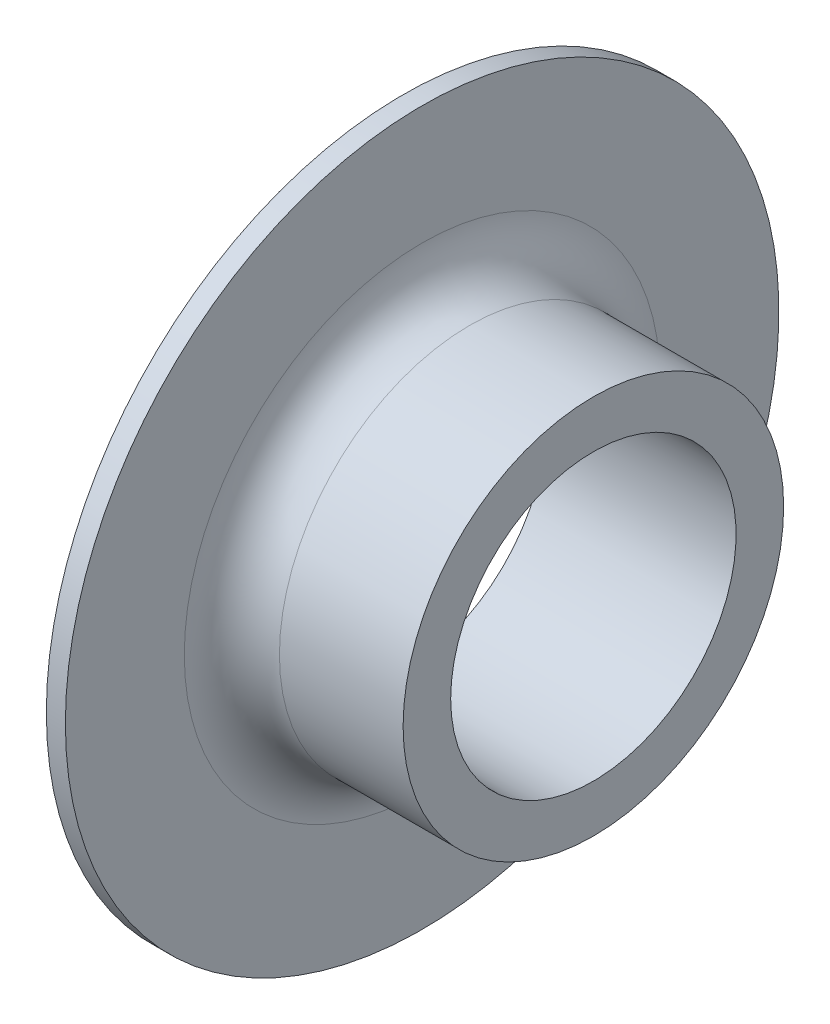
ISO-10303-21;
HEADER;
FILE_DESCRIPTION(('STEP AP214'),'2;1');
FILE_NAME('part.step','',(''),(''),'','','');
FILE_SCHEMA(('AUTOMOTIVE_DESIGN { 1 0 10303 214 1 1 1 1 }'));
ENDSEC;
DATA;
#1=APPLICATION_CONTEXT('core data for automotive mechanical design processes');
#2=APPLICATION_PROTOCOL_DEFINITION('international standard','automotive_design',2000,#1);
#3=PRODUCT_CONTEXT('',#1,'mechanical');
#4=PRODUCT('Part','Part','',(#3));
#5=PRODUCT_RELATED_PRODUCT_CATEGORY('part','',(#4));
#6=PRODUCT_DEFINITION_FORMATION('','',#4);
#7=PRODUCT_DEFINITION_CONTEXT('part definition',#1,'design');
#8=PRODUCT_DEFINITION('design','',#6,#7);
#9=PRODUCT_DEFINITION_SHAPE('','',#8);
#10=(LENGTH_UNIT() NAMED_UNIT(*) SI_UNIT(.MILLI.,.METRE.));
#11=(NAMED_UNIT(*) PLANE_ANGLE_UNIT() SI_UNIT($,.RADIAN.));
#12=(NAMED_UNIT(*) SI_UNIT($,.STERADIAN.) SOLID_ANGLE_UNIT());
#13=UNCERTAINTY_MEASURE_WITH_UNIT(LENGTH_MEASURE(1.E-05),#10,'distance_accuracy_value','');
#14=(GEOMETRIC_REPRESENTATION_CONTEXT(3) GLOBAL_UNCERTAINTY_ASSIGNED_CONTEXT((#13)) GLOBAL_UNIT_ASSIGNED_CONTEXT((#10,
#11,#12)) REPRESENTATION_CONTEXT('',''));
#15=CARTESIAN_POINT('',(0.,0.,0.));
#16=DIRECTION('',(0.,0.,1.));
#17=DIRECTION('',(1.,0.,0.));
#18=AXIS2_PLACEMENT_3D('',#15,#16,#17);
#19=CARTESIAN_POINT('',(0.,0.,0.));
#20=DIRECTION('',(-1.,0.,0.));
#21=DIRECTION('',(0.,0.,1.));
#22=AXIS2_PLACEMENT_3D('',#19,#20,#21);
#23=CYLINDRICAL_SURFACE('',#22,15.);
#24=CARTESIAN_POINT('',(0.,0.,0.));
#25=DIRECTION('',(-1.,0.,0.));
#26=DIRECTION('',(0.,0.,1.));
#27=AXIS2_PLACEMENT_3D('',#24,#25,#26);
#28=CIRCLE('',#27,15.);
#29=CARTESIAN_POINT('',(0.,0.,15.));
#30=VERTEX_POINT('',#29);
#31=EDGE_CURVE('E71',#30,#30,#28,.T.);
#32=ORIENTED_EDGE('',*,*,#31,.T.);
#33=EDGE_LOOP('',(#32));
#34=FACE_BOUND('',#33,.T.);
#35=CARTESIAN_POINT('',(20.,0.,0.));
#36=DIRECTION('',(-1.,0.,0.));
#37=DIRECTION('',(0.,0.,1.));
#38=AXIS2_PLACEMENT_3D('',#35,#36,#37);
#39=CIRCLE('',#38,15.);
#40=CARTESIAN_POINT('',(20.,0.,15.));
#41=VERTEX_POINT('',#40);
#42=EDGE_CURVE('E52',#41,#41,#39,.T.);
#43=ORIENTED_EDGE('',*,*,#42,.F.);
#44=EDGE_LOOP('',(#43));
#45=FACE_BOUND('',#44,.T.);
#46=ADVANCED_FACE('F39',(#34,#45),#23,.F.);
#47=CARTESIAN_POINT('',(20.,0.,0.));
#48=DIRECTION('',(1.,0.,0.));
#49=DIRECTION('',(0.,0.,-1.));
#50=AXIS2_PLACEMENT_3D('',#47,#48,#49);
#51=PLANE('',#50);
#52=ORIENTED_EDGE('',*,*,#42,.T.);
#53=EDGE_LOOP('',(#52));
#54=FACE_BOUND('',#53,.T.);
#55=CARTESIAN_POINT('',(20.,0.,0.));
#56=DIRECTION('',(-1.,0.,0.));
#57=DIRECTION('',(0.,0.,1.));
#58=AXIS2_PLACEMENT_3D('',#55,#56,#57);
#59=CIRCLE('',#58,20.);
#60=CARTESIAN_POINT('',(20.,0.,20.));
#61=VERTEX_POINT('',#60);
#62=EDGE_CURVE('E57',#61,#61,#59,.T.);
#63=ORIENTED_EDGE('',*,*,#62,.F.);
#64=EDGE_LOOP('',(#63));
#65=FACE_BOUND('',#64,.T.);
#66=ADVANCED_FACE('F92',(#54,#65),#51,.T.);
#67=CARTESIAN_POINT('',(0.,0.,0.));
#68=DIRECTION('',(-1.,0.,0.));
#69=DIRECTION('',(0.,0.,1.));
#70=AXIS2_PLACEMENT_3D('',#67,#68,#69);
#71=CYLINDRICAL_SURFACE('',#70,20.);
#72=CARTESIAN_POINT('',(7.,0.,0.));
#73=DIRECTION('',(1.,0.,0.));
#74=DIRECTION('',(0.,0.,-1.));
#75=AXIS2_PLACEMENT_3D('',#72,#73,#74);
#76=CIRCLE('',#75,20.);
#77=CARTESIAN_POINT('',(7.,0.,-20.));
#78=VERTEX_POINT('',#77);
#79=EDGE_CURVE('E10',#78,#78,#76,.T.);
#80=ORIENTED_EDGE('',*,*,#79,.T.);
#81=EDGE_LOOP('',(#80));
#82=FACE_BOUND('',#81,.T.);
#83=ORIENTED_EDGE('',*,*,#62,.T.);
#84=EDGE_LOOP('',(#83));
#85=FACE_BOUND('',#84,.T.);
#86=ADVANCED_FACE('F96',(#82,#85),#71,.T.);
#87=CARTESIAN_POINT('',(2.,0.,0.));
#88=DIRECTION('',(1.,0.,0.));
#89=DIRECTION('',(0.,0.,-1.));
#90=AXIS2_PLACEMENT_3D('',#87,#88,#89);
#91=PLANE('',#90);
#92=CARTESIAN_POINT('',(2.,0.,0.));
#93=DIRECTION('',(1.,0.,0.));
#94=DIRECTION('',(0.,0.,-1.));
#95=AXIS2_PLACEMENT_3D('',#92,#93,#94);
#96=CIRCLE('',#95,25.);
#97=CARTESIAN_POINT('',(2.,0.,-25.));
#98=VERTEX_POINT('',#97);
#99=EDGE_CURVE('E47',#98,#98,#96,.F.);
#100=ORIENTED_EDGE('',*,*,#99,.T.);
#101=EDGE_LOOP('',(#100));
#102=FACE_BOUND('',#101,.T.);
#103=CARTESIAN_POINT('',(2.,0.,0.));
#104=DIRECTION('',(-1.,0.,0.));
#105=DIRECTION('',(0.,0.,1.));
#106=AXIS2_PLACEMENT_3D('',#103,#104,#105);
#107=CIRCLE('',#106,37.5);
#108=CARTESIAN_POINT('',(2.,0.,37.5));
#109=VERTEX_POINT('',#108);
#110=EDGE_CURVE('E63',#109,#109,#107,.T.);
#111=ORIENTED_EDGE('',*,*,#110,.F.);
#112=EDGE_LOOP('',(#111));
#113=FACE_BOUND('',#112,.T.);
#114=ADVANCED_FACE('F88',(#102,#113),#91,.T.);
#115=CARTESIAN_POINT('',(0.,0.,0.));
#116=DIRECTION('',(-1.,0.,0.));
#117=DIRECTION('',(0.,0.,1.));
#118=AXIS2_PLACEMENT_3D('',#115,#116,#117);
#119=CYLINDRICAL_SURFACE('',#118,37.5);
#120=ORIENTED_EDGE('',*,*,#110,.T.);
#121=EDGE_LOOP('',(#120));
#122=FACE_BOUND('',#121,.T.);
#123=CARTESIAN_POINT('',(0.,0.,0.));
#124=DIRECTION('',(-1.,0.,0.));
#125=DIRECTION('',(0.,0.,1.));
#126=AXIS2_PLACEMENT_3D('',#123,#124,#125);
#127=CIRCLE('',#126,37.5);
#128=CARTESIAN_POINT('',(0.,0.,37.5));
#129=VERTEX_POINT('',#128);
#130=EDGE_CURVE('E67',#129,#129,#127,.T.);
#131=ORIENTED_EDGE('',*,*,#130,.F.);
#132=EDGE_LOOP('',(#131));
#133=FACE_BOUND('',#132,.T.);
#134=ADVANCED_FACE('F80',(#122,#133),#119,.T.);
#135=CARTESIAN_POINT('',(0.,0.,0.));
#136=DIRECTION('',(-1.,0.,0.));
#137=DIRECTION('',(0.,0.,1.));
#138=AXIS2_PLACEMENT_3D('',#135,#136,#137);
#139=PLANE('',#138);
#140=ORIENTED_EDGE('',*,*,#130,.T.);
#141=EDGE_LOOP('',(#140));
#142=FACE_BOUND('',#141,.T.);
#143=ORIENTED_EDGE('',*,*,#31,.F.);
#144=EDGE_LOOP('',(#143));
#145=FACE_BOUND('',#144,.T.);
#146=ADVANCED_FACE('F78',(#142,#145),#139,.T.);
#147=CARTESIAN_POINT('',(7.,0.,0.));
#148=DIRECTION('',(1.,0.,0.));
#149=DIRECTION('',(0.,0.,-1.));
#150=AXIS2_PLACEMENT_3D('',#147,#148,#149);
#151=TOROIDAL_SURFACE('',#150,25.,5.);
#152=ORIENTED_EDGE('',*,*,#79,.F.);
#153=EDGE_LOOP('',(#152));
#154=FACE_BOUND('',#153,.T.);
#155=ORIENTED_EDGE('',*,*,#99,.F.);
#156=EDGE_LOOP('',(#155));
#157=FACE_BOUND('',#156,.T.);
#158=ADVANCED_FACE('F41',(#154,#157),#151,.F.);
#159=CLOSED_SHELL('',(#46,#66,#86,#114,#134,#146,#158));
#160=MANIFOLD_SOLID_BREP('B2',#159);
#161=ADVANCED_BREP_SHAPE_REPRESENTATION('',(#18,#160),#14);
#162=SHAPE_DEFINITION_REPRESENTATION(#9,#161);
ENDSEC;
END-ISO-10303-21;
